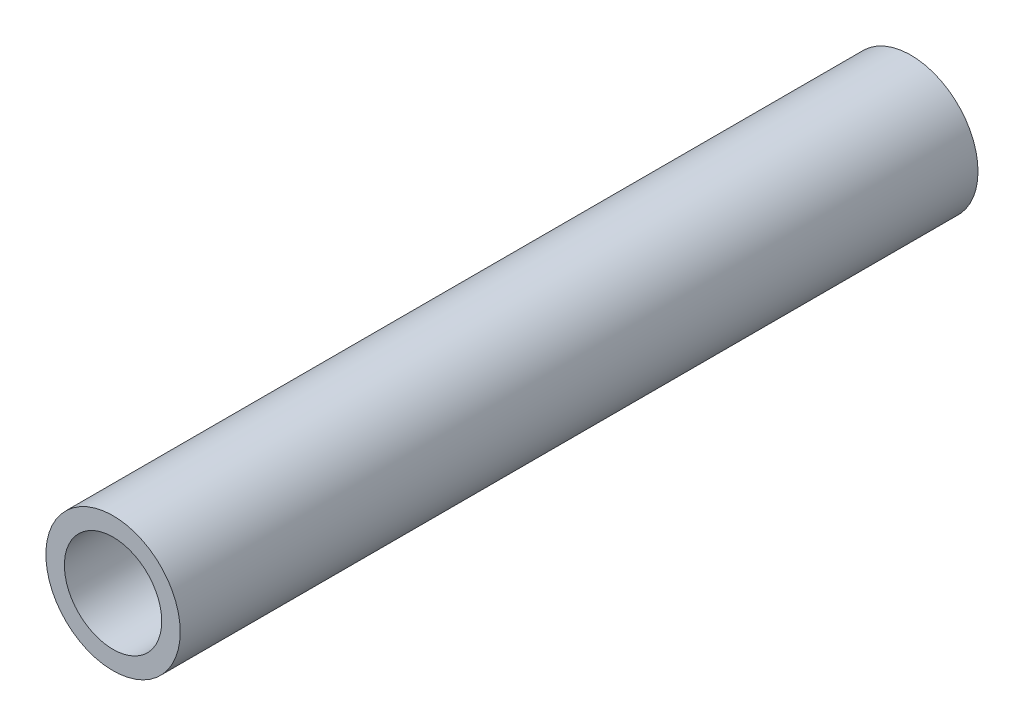
ISO-10303-21;
HEADER;
FILE_DESCRIPTION(('STEP AP214'),'2;1');
FILE_NAME('part.step','',(''),(''),'','','');
FILE_SCHEMA(('AUTOMOTIVE_DESIGN { 1 0 10303 214 1 1 1 1 }'));
ENDSEC;
DATA;
#1=APPLICATION_CONTEXT('core data for automotive mechanical design processes');
#2=APPLICATION_PROTOCOL_DEFINITION('international standard','automotive_design',2000,#1);
#3=PRODUCT_CONTEXT('',#1,'mechanical');
#4=PRODUCT('Part','Part','',(#3));
#5=PRODUCT_RELATED_PRODUCT_CATEGORY('part','',(#4));
#6=PRODUCT_DEFINITION_FORMATION('','',#4);
#7=PRODUCT_DEFINITION_CONTEXT('part definition',#1,'design');
#8=PRODUCT_DEFINITION('design','',#6,#7);
#9=PRODUCT_DEFINITION_SHAPE('','',#8);
#10=(LENGTH_UNIT() NAMED_UNIT(*) SI_UNIT(.MILLI.,.METRE.));
#11=(NAMED_UNIT(*) PLANE_ANGLE_UNIT() SI_UNIT($,.RADIAN.));
#12=(NAMED_UNIT(*) SI_UNIT($,.STERADIAN.) SOLID_ANGLE_UNIT());
#13=UNCERTAINTY_MEASURE_WITH_UNIT(LENGTH_MEASURE(1.E-05),#10,'distance_accuracy_value','');
#14=(GEOMETRIC_REPRESENTATION_CONTEXT(3) GLOBAL_UNCERTAINTY_ASSIGNED_CONTEXT((#13)) GLOBAL_UNIT_ASSIGNED_CONTEXT((#10,
#11,#12)) REPRESENTATION_CONTEXT('',''));
#15=CARTESIAN_POINT('',(0.,0.,0.));
#16=DIRECTION('',(0.,0.,1.));
#17=DIRECTION('',(1.,0.,0.));
#18=AXIS2_PLACEMENT_3D('',#15,#16,#17);
#19=CARTESIAN_POINT('',(0.,0.,127.));
#20=DIRECTION('',(0.,0.,1.));
#21=DIRECTION('',(1.,0.,0.));
#22=AXIS2_PLACEMENT_3D('',#19,#20,#21);
#23=PLANE('',#22);
#24=CARTESIAN_POINT('',(0.,0.,127.));
#25=DIRECTION('',(0.,0.,1.));
#26=DIRECTION('',(1.,0.,0.));
#27=AXIS2_PLACEMENT_3D('',#24,#25,#26);
#28=CIRCLE('',#27,10.6934);
#29=CARTESIAN_POINT('',(10.6934,0.,127.));
#30=VERTEX_POINT('',#29);
#31=EDGE_CURVE('E10',#30,#30,#28,.T.);
#32=ORIENTED_EDGE('',*,*,#31,.T.);
#33=EDGE_LOOP('',(#32));
#34=FACE_BOUND('',#33,.T.);
#35=CARTESIAN_POINT('',(0.,0.,127.));
#36=DIRECTION('',(0.,0.,1.));
#37=DIRECTION('',(1.,0.,0.));
#38=AXIS2_PLACEMENT_3D('',#35,#36,#37);
#39=CIRCLE('',#38,7.747);
#40=CARTESIAN_POINT('',(7.747,0.,127.));
#41=VERTEX_POINT('',#40);
#42=EDGE_CURVE('E46',#41,#41,#39,.T.);
#43=ORIENTED_EDGE('',*,*,#42,.F.);
#44=EDGE_LOOP('',(#43));
#45=FACE_BOUND('',#44,.T.);
#46=ADVANCED_FACE('F35',(#34,#45),#23,.T.);
#47=CARTESIAN_POINT('',(0.,0.,0.));
#48=DIRECTION('',(0.,0.,1.));
#49=DIRECTION('',(1.,0.,0.));
#50=AXIS2_PLACEMENT_3D('',#47,#48,#49);
#51=PLANE('',#50);
#52=CARTESIAN_POINT('',(0.,0.,0.));
#53=DIRECTION('',(0.,0.,1.));
#54=DIRECTION('',(1.,0.,0.));
#55=AXIS2_PLACEMENT_3D('',#52,#53,#54);
#56=CIRCLE('',#55,10.6934);
#57=CARTESIAN_POINT('',(10.6934,0.,0.));
#58=VERTEX_POINT('',#57);
#59=EDGE_CURVE('E39',#58,#58,#56,.T.);
#60=ORIENTED_EDGE('',*,*,#59,.F.);
#61=EDGE_LOOP('',(#60));
#62=FACE_BOUND('',#61,.T.);
#63=CARTESIAN_POINT('',(0.,0.,0.));
#64=DIRECTION('',(0.,0.,1.));
#65=DIRECTION('',(1.,0.,0.));
#66=AXIS2_PLACEMENT_3D('',#63,#64,#65);
#67=CIRCLE('',#66,7.747);
#68=CARTESIAN_POINT('',(7.747,0.,0.));
#69=VERTEX_POINT('',#68);
#70=EDGE_CURVE('E48',#69,#69,#67,.T.);
#71=ORIENTED_EDGE('',*,*,#70,.T.);
#72=EDGE_LOOP('',(#71));
#73=FACE_BOUND('',#72,.T.);
#74=ADVANCED_FACE('F58',(#62,#73),#51,.F.);
#75=CARTESIAN_POINT('',(0.,0.,127.));
#76=DIRECTION('',(0.,0.,-1.));
#77=DIRECTION('',(-1.,0.,0.));
#78=AXIS2_PLACEMENT_3D('',#75,#76,#77);
#79=CYLINDRICAL_SURFACE('',#78,10.6934);
#80=ORIENTED_EDGE('',*,*,#31,.F.);
#81=EDGE_LOOP('',(#80));
#82=FACE_BOUND('',#81,.T.);
#83=ORIENTED_EDGE('',*,*,#59,.T.);
#84=EDGE_LOOP('',(#83));
#85=FACE_BOUND('',#84,.T.);
#86=ADVANCED_FACE('F37',(#82,#85),#79,.T.);
#87=CARTESIAN_POINT('',(0.,0.,127.));
#88=DIRECTION('',(0.,0.,-1.));
#89=DIRECTION('',(-1.,0.,0.));
#90=AXIS2_PLACEMENT_3D('',#87,#88,#89);
#91=CYLINDRICAL_SURFACE('',#90,7.747);
#92=ORIENTED_EDGE('',*,*,#42,.T.);
#93=EDGE_LOOP('',(#92));
#94=FACE_BOUND('',#93,.T.);
#95=ORIENTED_EDGE('',*,*,#70,.F.);
#96=EDGE_LOOP('',(#95));
#97=FACE_BOUND('',#96,.T.);
#98=ADVANCED_FACE('F54',(#94,#97),#91,.F.);
#99=CLOSED_SHELL('',(#46,#74,#86,#98));
#100=MANIFOLD_SOLID_BREP('B2',#99);
#101=ADVANCED_BREP_SHAPE_REPRESENTATION('',(#18,#100),#14);
#102=SHAPE_DEFINITION_REPRESENTATION(#9,#101);
ENDSEC;
END-ISO-10303-21;
